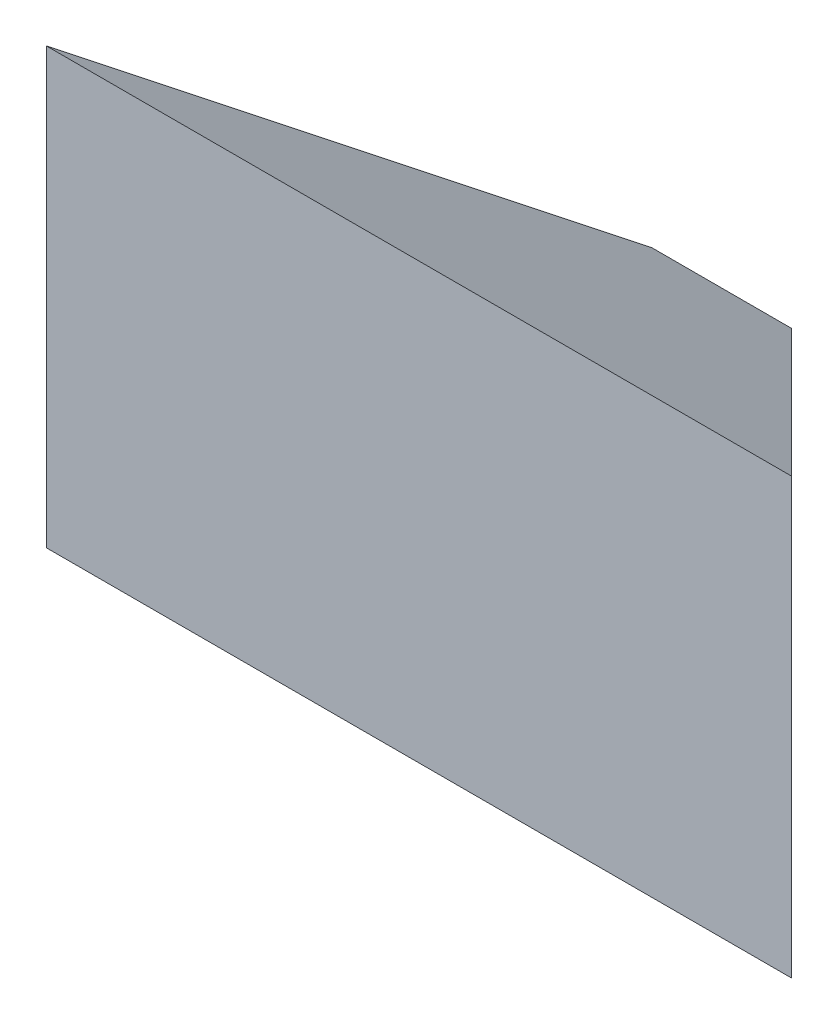
ISO-10303-21;
HEADER;
FILE_DESCRIPTION(('STEP AP214'),'2;1');
FILE_NAME('part.step','',(''),(''),'','','');
FILE_SCHEMA(('AUTOMOTIVE_DESIGN { 1 0 10303 214 1 1 1 1 }'));
ENDSEC;
DATA;
#1=APPLICATION_CONTEXT('core data for automotive mechanical design processes');
#2=APPLICATION_PROTOCOL_DEFINITION('international standard','automotive_design',2000,#1);
#3=PRODUCT_CONTEXT('',#1,'mechanical');
#4=PRODUCT('Part','Part','',(#3));
#5=PRODUCT_RELATED_PRODUCT_CATEGORY('part','',(#4));
#6=PRODUCT_DEFINITION_FORMATION('','',#4);
#7=PRODUCT_DEFINITION_CONTEXT('part definition',#1,'design');
#8=PRODUCT_DEFINITION('design','',#6,#7);
#9=PRODUCT_DEFINITION_SHAPE('','',#8);
#10=(LENGTH_UNIT() NAMED_UNIT(*) SI_UNIT(.MILLI.,.METRE.));
#11=(NAMED_UNIT(*) PLANE_ANGLE_UNIT() SI_UNIT($,.RADIAN.));
#12=(NAMED_UNIT(*) SI_UNIT($,.STERADIAN.) SOLID_ANGLE_UNIT());
#13=UNCERTAINTY_MEASURE_WITH_UNIT(LENGTH_MEASURE(1.E-05),#10,'distance_accuracy_value','');
#14=(GEOMETRIC_REPRESENTATION_CONTEXT(3) GLOBAL_UNCERTAINTY_ASSIGNED_CONTEXT((#13)) GLOBAL_UNIT_ASSIGNED_CONTEXT((#10,
#11,#12)) REPRESENTATION_CONTEXT('',''));
#15=CARTESIAN_POINT('',(0.,0.,0.));
#16=DIRECTION('',(0.,0.,1.));
#17=DIRECTION('',(1.,0.,0.));
#18=AXIS2_PLACEMENT_3D('',#15,#16,#17);
#19=CARTESIAN_POINT('',(0.,0.,50.));
#20=DIRECTION('',(0.,0.,-1.));
#21=DIRECTION('',(-1.,0.,0.));
#22=AXIS2_PLACEMENT_3D('',#19,#20,#21);
#23=PLANE('',#22);
#24=DIRECTION('',(0.,1.,0.));
#25=VECTOR('',#24,1.);
#26=CARTESIAN_POINT('',(61.5,-27.8683602771363,50.));
#27=LINE('',#26,#25);
#28=CARTESIAN_POINT('',(61.5,-27.8683602771363,50.));
#29=VERTEX_POINT('',#28);
#30=CARTESIAN_POINT('',(61.5,43.9035661449734,50.));
#31=VERTEX_POINT('',#30);
#32=EDGE_CURVE('E117',#29,#31,#27,.T.);
#33=ORIENTED_EDGE('',*,*,#32,.T.);
#34=DIRECTION('',(-1.,0.,0.));
#35=VECTOR('',#34,1.);
#36=CARTESIAN_POINT('',(-61.5,43.9035661449734,50.));
#37=LINE('',#36,#35);
#38=CARTESIAN_POINT('',(-61.5,43.9035661449734,50.));
#39=VERTEX_POINT('',#38);
#40=EDGE_CURVE('E119',#31,#39,#37,.T.);
#41=ORIENTED_EDGE('',*,*,#40,.T.);
#42=DIRECTION('',(0.,-1.,0.));
#43=VECTOR('',#42,1.);
#44=CARTESIAN_POINT('',(-61.5,-27.8683602771363,50.));
#45=LINE('',#44,#43);
#46=CARTESIAN_POINT('',(-61.5,-27.8683602771363,50.));
#47=VERTEX_POINT('',#46);
#48=EDGE_CURVE('E53',#39,#47,#45,.T.);
#49=ORIENTED_EDGE('',*,*,#48,.T.);
#50=DIRECTION('',(1.,0.,0.));
#51=VECTOR('',#50,1.);
#52=CARTESIAN_POINT('',(-61.5,-27.8683602771363,50.));
#53=LINE('',#52,#51);
#54=EDGE_CURVE('E12',#47,#29,#53,.T.);
#55=ORIENTED_EDGE('',*,*,#54,.T.);
#56=EDGE_LOOP('',(#33,#41,#49,#55));
#57=FACE_BOUND('',#56,.T.);
#58=ADVANCED_FACE('F43',(#57),#23,.F.);
#59=CARTESIAN_POINT('',(0.,0.,0.));
#60=DIRECTION('',(0.,0.,-1.));
#61=DIRECTION('',(-1.,0.,0.));
#62=AXIS2_PLACEMENT_3D('',#59,#60,#61);
#63=PLANE('',#62);
#64=DIRECTION('',(0.,1.,0.));
#65=VECTOR('',#64,1.);
#66=CARTESIAN_POINT('',(11.5,1.,0.));
#67=LINE('',#66,#65);
#68=CARTESIAN_POINT('',(11.5,1.,0.));
#69=VERTEX_POINT('',#68);
#70=CARTESIAN_POINT('',(11.5,15.0352058678371,0.));
#71=VERTEX_POINT('',#70);
#72=EDGE_CURVE('E111',#69,#71,#67,.T.);
#73=ORIENTED_EDGE('',*,*,#72,.F.);
#74=DIRECTION('',(1.,0.,0.));
#75=VECTOR('',#74,1.);
#76=CARTESIAN_POINT('',(-11.5,1.,0.));
#77=LINE('',#76,#75);
#78=CARTESIAN_POINT('',(-11.5,1.,0.));
#79=VERTEX_POINT('',#78);
#80=EDGE_CURVE('E95',#79,#69,#77,.T.);
#81=ORIENTED_EDGE('',*,*,#80,.F.);
#82=DIRECTION('',(0.,-1.,0.));
#83=VECTOR('',#82,1.);
#84=CARTESIAN_POINT('',(-11.5,1.,0.));
#85=LINE('',#84,#83);
#86=CARTESIAN_POINT('',(-11.5,15.0352058678371,0.));
#87=VERTEX_POINT('',#86);
#88=EDGE_CURVE('E86',#87,#79,#85,.T.);
#89=ORIENTED_EDGE('',*,*,#88,.F.);
#90=DIRECTION('',(-1.,0.,0.));
#91=VECTOR('',#90,1.);
#92=CARTESIAN_POINT('',(-11.5,15.0352058678371,0.));
#93=LINE('',#92,#91);
#94=EDGE_CURVE('E91',#71,#87,#93,.T.);
#95=ORIENTED_EDGE('',*,*,#94,.F.);
#96=EDGE_LOOP('',(#73,#81,#89,#95));
#97=FACE_BOUND('',#96,.T.);
#98=ADVANCED_FACE('F90',(#97),#63,.T.);
#99=CARTESIAN_POINT('',(0.,0.749988999515979,0.433019052838325));
#100=DIRECTION('',(0.,-0.866019052628739,-0.500011000363013));
#101=DIRECTION('',(0.,0.500011000363013,-0.866019052628739));
#102=AXIS2_PLACEMENT_3D('',#99,#100,#101);
#103=PLANE('',#102);
#104=DIRECTION('',(0.654650927253652,-0.377973976474395,0.654650927253652));
#105=VECTOR('',#104,1.);
#106=CARTESIAN_POINT('',(11.5,1.,0.));
#107=LINE('',#106,#105);
#108=EDGE_CURVE('E161',#69,#29,#107,.T.);
#109=ORIENTED_EDGE('',*,*,#108,.T.);
#110=ORIENTED_EDGE('',*,*,#54,.F.);
#111=DIRECTION('',(-0.654650927253652,-0.377973976474395,0.654650927253652));
#112=VECTOR('',#111,1.);
#113=CARTESIAN_POINT('',(-11.5,1.,0.));
#114=LINE('',#113,#112);
#115=EDGE_CURVE('E68',#79,#47,#114,.T.);
#116=ORIENTED_EDGE('',*,*,#115,.F.);
#117=ORIENTED_EDGE('',*,*,#80,.T.);
#118=EDGE_LOOP('',(#109,#110,#116,#117));
#119=FACE_BOUND('',#118,.T.);
#120=ADVANCED_FACE('F142',(#119),#103,.T.);
#121=CARTESIAN_POINT('',(-5.75,0.,-5.75));
#122=DIRECTION('',(0.707106781186547,0.,0.707106781186547));
#123=DIRECTION('',(0.707106781186548,0.,-0.707106781186547));
#124=AXIS2_PLACEMENT_3D('',#121,#122,#123);
#125=PLANE('',#124);
#126=ORIENTED_EDGE('',*,*,#115,.T.);
#127=ORIENTED_EDGE('',*,*,#48,.F.);
#128=DIRECTION('',(-0.654650927253652,0.377973976474395,0.654650927253652));
#129=VECTOR('',#128,1.);
#130=CARTESIAN_POINT('',(-11.5,15.0352058678371,0.));
#131=LINE('',#130,#129);
#132=EDGE_CURVE('E107',#87,#39,#131,.T.);
#133=ORIENTED_EDGE('',*,*,#132,.F.);
#134=ORIENTED_EDGE('',*,*,#88,.T.);
#135=EDGE_LOOP('',(#126,#127,#133,#134));
#136=FACE_BOUND('',#135,.T.);
#137=ADVANCED_FACE('F115',(#136),#125,.F.);
#138=CARTESIAN_POINT('',(5.75,0.,-5.75));
#139=DIRECTION('',(-0.707106781186547,0.,0.707106781186547));
#140=DIRECTION('',(0.707106781186548,0.,0.707106781186548));
#141=AXIS2_PLACEMENT_3D('',#138,#139,#140);
#142=PLANE('',#141);
#143=DIRECTION('',(0.654650927253652,0.377973976474395,0.654650927253652));
#144=VECTOR('',#143,1.);
#145=CARTESIAN_POINT('',(11.5,15.0352058678371,0.));
#146=LINE('',#145,#144);
#147=EDGE_CURVE('E110',#71,#31,#146,.T.);
#148=ORIENTED_EDGE('',*,*,#147,.T.);
#149=ORIENTED_EDGE('',*,*,#32,.F.);
#150=ORIENTED_EDGE('',*,*,#108,.F.);
#151=ORIENTED_EDGE('',*,*,#72,.T.);
#152=EDGE_LOOP('',(#148,#149,#150,#151));
#153=FACE_BOUND('',#152,.T.);
#154=ADVANCED_FACE('F141',(#153),#142,.F.);
#155=CARTESIAN_POINT('',(0.,11.2762390063359,-6.51053060412005));
#156=DIRECTION('',(0.,0.866019052628739,-0.500011000363013));
#157=DIRECTION('',(0.,0.500011000363013,0.866019052628739));
#158=AXIS2_PLACEMENT_3D('',#155,#156,#157);
#159=PLANE('',#158);
#160=ORIENTED_EDGE('',*,*,#132,.T.);
#161=ORIENTED_EDGE('',*,*,#40,.F.);
#162=ORIENTED_EDGE('',*,*,#147,.F.);
#163=ORIENTED_EDGE('',*,*,#94,.T.);
#164=EDGE_LOOP('',(#160,#161,#162,#163));
#165=FACE_BOUND('',#164,.T.);
#166=ADVANCED_FACE('F106',(#165),#159,.T.);
#167=CLOSED_SHELL('',(#58,#98,#120,#137,#154,#166));
#168=MANIFOLD_SOLID_BREP('B2',#167);
#169=ADVANCED_BREP_SHAPE_REPRESENTATION('',(#18,#168),#14);
#170=SHAPE_DEFINITION_REPRESENTATION(#9,#169);
ENDSEC;
END-ISO-10303-21;
